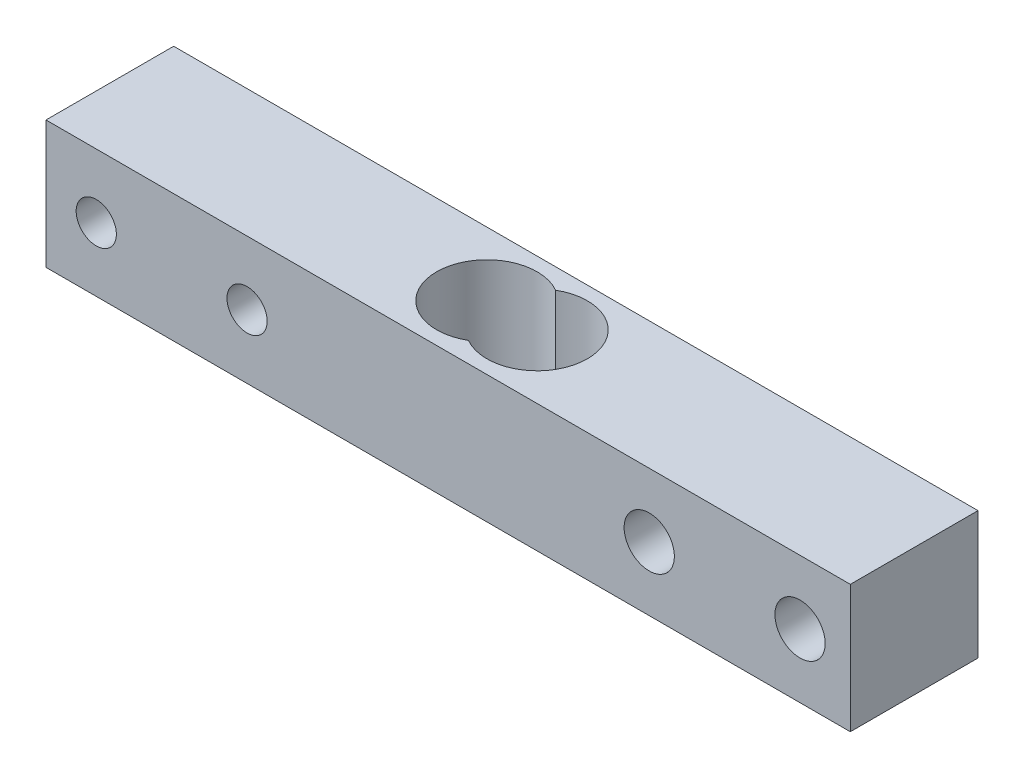
ISO-10303-21;
HEADER;
FILE_DESCRIPTION(('STEP AP214'),'2;1');
FILE_NAME('part.step','',(''),(''),'','','');
FILE_SCHEMA(('AUTOMOTIVE_DESIGN { 1 0 10303 214 1 1 1 1 }'));
ENDSEC;
DATA;
#1=APPLICATION_CONTEXT('core data for automotive mechanical design processes');
#2=APPLICATION_PROTOCOL_DEFINITION('international standard','automotive_design',2000,#1);
#3=PRODUCT_CONTEXT('',#1,'mechanical');
#4=PRODUCT('Part','Part','',(#3));
#5=PRODUCT_RELATED_PRODUCT_CATEGORY('part','',(#4));
#6=PRODUCT_DEFINITION_FORMATION('','',#4);
#7=PRODUCT_DEFINITION_CONTEXT('part definition',#1,'design');
#8=PRODUCT_DEFINITION('design','',#6,#7);
#9=PRODUCT_DEFINITION_SHAPE('','',#8);
#10=(LENGTH_UNIT() NAMED_UNIT(*) SI_UNIT(.MILLI.,.METRE.));
#11=(NAMED_UNIT(*) PLANE_ANGLE_UNIT() SI_UNIT($,.RADIAN.));
#12=(NAMED_UNIT(*) SI_UNIT($,.STERADIAN.) SOLID_ANGLE_UNIT());
#13=UNCERTAINTY_MEASURE_WITH_UNIT(LENGTH_MEASURE(1.E-05),#10,'distance_accuracy_value','');
#14=(GEOMETRIC_REPRESENTATION_CONTEXT(3) GLOBAL_UNCERTAINTY_ASSIGNED_CONTEXT((#13)) GLOBAL_UNIT_ASSIGNED_CONTEXT((#10,
#11,#12)) REPRESENTATION_CONTEXT('',''));
#15=CARTESIAN_POINT('',(0.,0.,0.));
#16=DIRECTION('',(0.,0.,1.));
#17=DIRECTION('',(1.,0.,0.));
#18=AXIS2_PLACEMENT_3D('',#15,#16,#17);
#19=CARTESIAN_POINT('',(40.,6.34999999999999,12.7));
#20=DIRECTION('',(-1.,0.,0.));
#21=DIRECTION('',(0.,0.,1.));
#22=AXIS2_PLACEMENT_3D('',#19,#20,#21);
#23=PLANE('',#22);
#24=DIRECTION('',(0.,1.,0.));
#25=VECTOR('',#24,1.);
#26=CARTESIAN_POINT('',(40.,6.35,0.));
#27=LINE('',#26,#25);
#28=CARTESIAN_POINT('',(40.,-6.35,0.));
#29=VERTEX_POINT('',#28);
#30=CARTESIAN_POINT('',(40.,6.35,0.));
#31=VERTEX_POINT('',#30);
#32=EDGE_CURVE('E120',#29,#31,#27,.T.);
#33=ORIENTED_EDGE('',*,*,#32,.T.);
#34=DIRECTION('',(0.,0.,-1.));
#35=VECTOR('',#34,1.);
#36=CARTESIAN_POINT('',(40.,6.34999999999999,12.7));
#37=LINE('',#36,#35);
#38=CARTESIAN_POINT('',(40.,6.34999999999999,12.7));
#39=VERTEX_POINT('',#38);
#40=EDGE_CURVE('E149',#39,#31,#37,.T.);
#41=ORIENTED_EDGE('',*,*,#40,.F.);
#42=DIRECTION('',(0.,1.,0.));
#43=VECTOR('',#42,1.);
#44=CARTESIAN_POINT('',(40.,6.34999999999999,12.7));
#45=LINE('',#44,#43);
#46=CARTESIAN_POINT('',(40.,-6.35000000000017,12.7));
#47=VERTEX_POINT('',#46);
#48=EDGE_CURVE('E123',#47,#39,#45,.T.);
#49=ORIENTED_EDGE('',*,*,#48,.F.);
#50=DIRECTION('',(0.,0.,-1.));
#51=VECTOR('',#50,1.);
#52=CARTESIAN_POINT('',(40.,-6.35000000000017,12.7));
#53=LINE('',#52,#51);
#54=EDGE_CURVE('E133',#47,#29,#53,.T.);
#55=ORIENTED_EDGE('',*,*,#54,.T.);
#56=EDGE_LOOP('',(#33,#41,#49,#55));
#57=FACE_BOUND('',#56,.T.);
#58=ADVANCED_FACE('F34',(#57),#23,.F.);
#59=CARTESIAN_POINT('',(-40.,6.35,12.7));
#60=DIRECTION('',(0.,-1.,0.));
#61=DIRECTION('',(0.,0.,-1.));
#62=AXIS2_PLACEMENT_3D('',#59,#60,#61);
#63=PLANE('',#62);
#64=CARTESIAN_POINT('',(-2.5,6.35,6.34999999999999));
#65=DIRECTION('',(0.,1.,0.));
#66=DIRECTION('',(0.,0.,1.));
#67=AXIS2_PLACEMENT_3D('',#64,#65,#66);
#68=CIRCLE('',#67,5.);
#69=CARTESIAN_POINT('',(0.,6.35,2.01987298107779));
#70=VERTEX_POINT('',#69);
#71=CARTESIAN_POINT('',(0.,6.35,10.6801270189222));
#72=VERTEX_POINT('',#71);
#73=EDGE_CURVE('E90',#70,#72,#68,.T.);
#74=ORIENTED_EDGE('',*,*,#73,.F.);
#75=CARTESIAN_POINT('',(2.5,6.35,6.34999999999984));
#76=DIRECTION('',(0.,1.,0.));
#77=DIRECTION('',(0.,0.,1.));
#78=AXIS2_PLACEMENT_3D('',#75,#76,#77);
#79=CIRCLE('',#78,4.99999999999999);
#80=EDGE_CURVE('E48',#72,#70,#79,.T.);
#81=ORIENTED_EDGE('',*,*,#80,.F.);
#82=EDGE_LOOP('',(#74,#81));
#83=FACE_BOUND('',#82,.T.);
#84=DIRECTION('',(-1.,0.,0.));
#85=VECTOR('',#84,1.);
#86=CARTESIAN_POINT('',(-40.,6.35,0.));
#87=LINE('',#86,#85);
#88=CARTESIAN_POINT('',(-40.,6.35,0.));
#89=VERTEX_POINT('',#88);
#90=EDGE_CURVE('E136',#31,#89,#87,.T.);
#91=ORIENTED_EDGE('',*,*,#90,.T.);
#92=DIRECTION('',(0.,0.,-1.));
#93=VECTOR('',#92,1.);
#94=CARTESIAN_POINT('',(-40.,6.35,12.7));
#95=LINE('',#94,#93);
#96=CARTESIAN_POINT('',(-40.,6.35,12.7));
#97=VERTEX_POINT('',#96);
#98=EDGE_CURVE('E146',#97,#89,#95,.T.);
#99=ORIENTED_EDGE('',*,*,#98,.F.);
#100=DIRECTION('',(-1.,0.,0.));
#101=VECTOR('',#100,1.);
#102=CARTESIAN_POINT('',(-40.,6.35,12.7));
#103=LINE('',#102,#101);
#104=EDGE_CURVE('E126',#39,#97,#103,.T.);
#105=ORIENTED_EDGE('',*,*,#104,.F.);
#106=ORIENTED_EDGE('',*,*,#40,.T.);
#107=EDGE_LOOP('',(#91,#99,#105,#106));
#108=FACE_BOUND('',#107,.T.);
#109=ADVANCED_FACE('F94',(#83,#108),#63,.F.);
#110=CARTESIAN_POINT('',(-40.,6.35,12.7));
#111=DIRECTION('',(1.,0.,0.));
#112=DIRECTION('',(0.,0.,-1.));
#113=AXIS2_PLACEMENT_3D('',#110,#111,#112);
#114=PLANE('',#113);
#115=DIRECTION('',(0.,-1.,0.));
#116=VECTOR('',#115,1.);
#117=CARTESIAN_POINT('',(-40.,6.35,0.));
#118=LINE('',#117,#116);
#119=CARTESIAN_POINT('',(-40.,-6.35,0.));
#120=VERTEX_POINT('',#119);
#121=EDGE_CURVE('E138',#89,#120,#118,.T.);
#122=ORIENTED_EDGE('',*,*,#121,.T.);
#123=DIRECTION('',(0.,0.,-1.));
#124=VECTOR('',#123,1.);
#125=CARTESIAN_POINT('',(-40.,-6.35,12.7));
#126=LINE('',#125,#124);
#127=CARTESIAN_POINT('',(-40.,-6.35,12.7));
#128=VERTEX_POINT('',#127);
#129=EDGE_CURVE('E143',#128,#120,#126,.T.);
#130=ORIENTED_EDGE('',*,*,#129,.F.);
#131=DIRECTION('',(0.,-1.,0.));
#132=VECTOR('',#131,1.);
#133=CARTESIAN_POINT('',(-40.,6.35,12.7));
#134=LINE('',#133,#132);
#135=EDGE_CURVE('E129',#97,#128,#134,.T.);
#136=ORIENTED_EDGE('',*,*,#135,.F.);
#137=ORIENTED_EDGE('',*,*,#98,.T.);
#138=EDGE_LOOP('',(#122,#130,#136,#137));
#139=FACE_BOUND('',#138,.T.);
#140=ADVANCED_FACE('F156',(#139),#114,.F.);
#141=CARTESIAN_POINT('',(-40.,-6.35,12.7));
#142=DIRECTION('',(0.,1.,0.));
#143=DIRECTION('',(0.,0.,1.));
#144=AXIS2_PLACEMENT_3D('',#141,#142,#143);
#145=PLANE('',#144);
#146=CARTESIAN_POINT('',(-2.5,-6.34999999999999,6.34999999999999));
#147=DIRECTION('',(0.,1.,0.));
#148=DIRECTION('',(0.,0.,1.));
#149=AXIS2_PLACEMENT_3D('',#146,#147,#148);
#150=CIRCLE('',#149,5.);
#151=CARTESIAN_POINT('',(0.,-6.35000000000002,2.01987298107764));
#152=VERTEX_POINT('',#151);
#153=CARTESIAN_POINT('',(0.,-6.35,10.680127018922));
#154=VERTEX_POINT('',#153);
#155=EDGE_CURVE('E41',#152,#154,#150,.T.);
#156=ORIENTED_EDGE('',*,*,#155,.T.);
#157=CARTESIAN_POINT('',(2.5,-6.35,6.34999999999983));
#158=DIRECTION('',(0.,1.,0.));
#159=DIRECTION('',(0.,0.,1.));
#160=AXIS2_PLACEMENT_3D('',#157,#158,#159);
#161=CIRCLE('',#160,4.99999999999999);
#162=EDGE_CURVE('E11',#154,#152,#161,.T.);
#163=ORIENTED_EDGE('',*,*,#162,.T.);
#164=EDGE_LOOP('',(#156,#163));
#165=FACE_BOUND('',#164,.T.);
#166=DIRECTION('',(1.,0.,0.));
#167=VECTOR('',#166,1.);
#168=CARTESIAN_POINT('',(-40.,-6.35,0.));
#169=LINE('',#168,#167);
#170=EDGE_CURVE('E127',#120,#29,#169,.T.);
#171=ORIENTED_EDGE('',*,*,#170,.T.);
#172=ORIENTED_EDGE('',*,*,#54,.F.);
#173=DIRECTION('',(1.,0.,0.));
#174=VECTOR('',#173,1.);
#175=CARTESIAN_POINT('',(-40.,-6.35,12.7));
#176=LINE('',#175,#174);
#177=EDGE_CURVE('E131',#128,#47,#176,.T.);
#178=ORIENTED_EDGE('',*,*,#177,.F.);
#179=ORIENTED_EDGE('',*,*,#129,.T.);
#180=EDGE_LOOP('',(#171,#172,#178,#179));
#181=FACE_BOUND('',#180,.T.);
#182=ADVANCED_FACE('F152',(#165,#181),#145,.F.);
#183=CARTESIAN_POINT('',(0.,0.,12.7));
#184=DIRECTION('',(0.,0.,1.));
#185=DIRECTION('',(1.,0.,0.));
#186=AXIS2_PLACEMENT_3D('',#183,#184,#185);
#187=PLANE('',#186);
#188=CARTESIAN_POINT('',(-20.,0.,12.7));
#189=DIRECTION('',(0.,0.,1.));
#190=DIRECTION('',(1.,0.,0.));
#191=AXIS2_PLACEMENT_3D('',#188,#189,#190);
#192=CIRCLE('',#191,2.);
#193=CARTESIAN_POINT('',(-18.,0.,12.7));
#194=VERTEX_POINT('',#193);
#195=EDGE_CURVE('E103',#194,#194,#192,.T.);
#196=ORIENTED_EDGE('',*,*,#195,.F.);
#197=EDGE_LOOP('',(#196));
#198=FACE_BOUND('',#197,.T.);
#199=CARTESIAN_POINT('',(20.,0.,12.7));
#200=DIRECTION('',(0.,0.,1.));
#201=DIRECTION('',(1.,0.,0.));
#202=AXIS2_PLACEMENT_3D('',#199,#200,#201);
#203=CIRCLE('',#202,2.5);
#204=CARTESIAN_POINT('',(22.5,0.,12.7));
#205=VERTEX_POINT('',#204);
#206=EDGE_CURVE('E109',#205,#205,#203,.T.);
#207=ORIENTED_EDGE('',*,*,#206,.F.);
#208=EDGE_LOOP('',(#207));
#209=FACE_BOUND('',#208,.T.);
#210=CARTESIAN_POINT('',(35.,0.,12.7));
#211=DIRECTION('',(0.,0.,1.));
#212=DIRECTION('',(1.,0.,0.));
#213=AXIS2_PLACEMENT_3D('',#210,#211,#212);
#214=CIRCLE('',#213,2.5);
#215=CARTESIAN_POINT('',(37.5,0.,12.7));
#216=VERTEX_POINT('',#215);
#217=EDGE_CURVE('E86',#216,#216,#214,.T.);
#218=ORIENTED_EDGE('',*,*,#217,.F.);
#219=EDGE_LOOP('',(#218));
#220=FACE_BOUND('',#219,.T.);
#221=CARTESIAN_POINT('',(-35.,0.,12.7));
#222=DIRECTION('',(0.,0.,1.));
#223=DIRECTION('',(1.,0.,0.));
#224=AXIS2_PLACEMENT_3D('',#221,#222,#223);
#225=CIRCLE('',#224,2.);
#226=CARTESIAN_POINT('',(-33.,0.,12.7));
#227=VERTEX_POINT('',#226);
#228=EDGE_CURVE('E102',#227,#227,#225,.T.);
#229=ORIENTED_EDGE('',*,*,#228,.F.);
#230=EDGE_LOOP('',(#229));
#231=FACE_BOUND('',#230,.T.);
#232=ORIENTED_EDGE('',*,*,#48,.T.);
#233=ORIENTED_EDGE('',*,*,#104,.T.);
#234=ORIENTED_EDGE('',*,*,#135,.T.);
#235=ORIENTED_EDGE('',*,*,#177,.T.);
#236=EDGE_LOOP('',(#232,#233,#234,#235));
#237=FACE_BOUND('',#236,.T.);
#238=ADVANCED_FACE('F155',(#198,#209,#220,#231,#237),#187,.T.);
#239=CARTESIAN_POINT('',(0.,0.,0.));
#240=DIRECTION('',(0.,0.,1.));
#241=DIRECTION('',(1.,0.,0.));
#242=AXIS2_PLACEMENT_3D('',#239,#240,#241);
#243=PLANE('',#242);
#244=CARTESIAN_POINT('',(-20.,0.,0.));
#245=DIRECTION('',(0.,0.,1.));
#246=DIRECTION('',(1.,0.,0.));
#247=AXIS2_PLACEMENT_3D('',#244,#245,#246);
#248=CIRCLE('',#247,2.);
#249=CARTESIAN_POINT('',(-18.,0.,0.));
#250=VERTEX_POINT('',#249);
#251=EDGE_CURVE('E99',#250,#250,#248,.T.);
#252=ORIENTED_EDGE('',*,*,#251,.T.);
#253=EDGE_LOOP('',(#252));
#254=FACE_BOUND('',#253,.T.);
#255=CARTESIAN_POINT('',(20.,0.,0.));
#256=DIRECTION('',(0.,0.,1.));
#257=DIRECTION('',(1.,0.,0.));
#258=AXIS2_PLACEMENT_3D('',#255,#256,#257);
#259=CIRCLE('',#258,2.5);
#260=CARTESIAN_POINT('',(22.5,0.,0.));
#261=VERTEX_POINT('',#260);
#262=EDGE_CURVE('E106',#261,#261,#259,.T.);
#263=ORIENTED_EDGE('',*,*,#262,.T.);
#264=EDGE_LOOP('',(#263));
#265=FACE_BOUND('',#264,.T.);
#266=CARTESIAN_POINT('',(35.,0.,0.));
#267=DIRECTION('',(0.,0.,1.));
#268=DIRECTION('',(1.,0.,0.));
#269=AXIS2_PLACEMENT_3D('',#266,#267,#268);
#270=CIRCLE('',#269,2.5);
#271=CARTESIAN_POINT('',(37.5,0.,0.));
#272=VERTEX_POINT('',#271);
#273=EDGE_CURVE('E112',#272,#272,#270,.T.);
#274=ORIENTED_EDGE('',*,*,#273,.T.);
#275=EDGE_LOOP('',(#274));
#276=FACE_BOUND('',#275,.T.);
#277=CARTESIAN_POINT('',(-35.,0.,0.));
#278=DIRECTION('',(0.,0.,1.));
#279=DIRECTION('',(1.,0.,0.));
#280=AXIS2_PLACEMENT_3D('',#277,#278,#279);
#281=CIRCLE('',#280,2.);
#282=CARTESIAN_POINT('',(-33.,0.,0.));
#283=VERTEX_POINT('',#282);
#284=EDGE_CURVE('E117',#283,#283,#281,.T.);
#285=ORIENTED_EDGE('',*,*,#284,.T.);
#286=EDGE_LOOP('',(#285));
#287=FACE_BOUND('',#286,.T.);
#288=ORIENTED_EDGE('',*,*,#32,.F.);
#289=ORIENTED_EDGE('',*,*,#170,.F.);
#290=ORIENTED_EDGE('',*,*,#121,.F.);
#291=ORIENTED_EDGE('',*,*,#90,.F.);
#292=EDGE_LOOP('',(#288,#289,#290,#291));
#293=FACE_BOUND('',#292,.T.);
#294=ADVANCED_FACE('F168',(#254,#265,#276,#287,#293),#243,.F.);
#295=CARTESIAN_POINT('',(-35.,0.,0.));
#296=DIRECTION('',(0.,0.,1.));
#297=DIRECTION('',(1.,0.,0.));
#298=AXIS2_PLACEMENT_3D('',#295,#296,#297);
#299=CYLINDRICAL_SURFACE('',#298,2.);
#300=ORIENTED_EDGE('',*,*,#284,.F.);
#301=EDGE_LOOP('',(#300));
#302=FACE_BOUND('',#301,.T.);
#303=ORIENTED_EDGE('',*,*,#228,.T.);
#304=EDGE_LOOP('',(#303));
#305=FACE_BOUND('',#304,.T.);
#306=ADVANCED_FACE('F213',(#302,#305),#299,.F.);
#307=CARTESIAN_POINT('',(35.,0.,0.));
#308=DIRECTION('',(0.,0.,1.));
#309=DIRECTION('',(1.,0.,0.));
#310=AXIS2_PLACEMENT_3D('',#307,#308,#309);
#311=CYLINDRICAL_SURFACE('',#310,2.5);
#312=ORIENTED_EDGE('',*,*,#273,.F.);
#313=EDGE_LOOP('',(#312));
#314=FACE_BOUND('',#313,.T.);
#315=ORIENTED_EDGE('',*,*,#217,.T.);
#316=EDGE_LOOP('',(#315));
#317=FACE_BOUND('',#316,.T.);
#318=ADVANCED_FACE('F223',(#314,#317),#311,.F.);
#319=CARTESIAN_POINT('',(20.,0.,0.));
#320=DIRECTION('',(0.,0.,1.));
#321=DIRECTION('',(1.,0.,0.));
#322=AXIS2_PLACEMENT_3D('',#319,#320,#321);
#323=CYLINDRICAL_SURFACE('',#322,2.5);
#324=ORIENTED_EDGE('',*,*,#262,.F.);
#325=EDGE_LOOP('',(#324));
#326=FACE_BOUND('',#325,.T.);
#327=ORIENTED_EDGE('',*,*,#206,.T.);
#328=EDGE_LOOP('',(#327));
#329=FACE_BOUND('',#328,.T.);
#330=ADVANCED_FACE('F233',(#326,#329),#323,.F.);
#331=CARTESIAN_POINT('',(-20.,0.,0.));
#332=DIRECTION('',(0.,0.,1.));
#333=DIRECTION('',(1.,0.,0.));
#334=AXIS2_PLACEMENT_3D('',#331,#332,#333);
#335=CYLINDRICAL_SURFACE('',#334,2.);
#336=ORIENTED_EDGE('',*,*,#251,.F.);
#337=EDGE_LOOP('',(#336));
#338=FACE_BOUND('',#337,.T.);
#339=ORIENTED_EDGE('',*,*,#195,.T.);
#340=EDGE_LOOP('',(#339));
#341=FACE_BOUND('',#340,.T.);
#342=ADVANCED_FACE('F243',(#338,#341),#335,.F.);
#343=CARTESIAN_POINT('',(2.5,-13.35,6.34999999999998));
#344=DIRECTION('',(0.,1.,0.));
#345=DIRECTION('',(0.,0.,1.));
#346=AXIS2_PLACEMENT_3D('',#343,#344,#345);
#347=CYLINDRICAL_SURFACE('',#346,4.99999999999999);
#348=DIRECTION('',(0.,1.,0.));
#349=VECTOR('',#348,1.);
#350=CARTESIAN_POINT('',(0.,-13.35,10.6801270189222));
#351=LINE('',#350,#349);
#352=EDGE_CURVE('E55',#154,#72,#351,.T.);
#353=ORIENTED_EDGE('',*,*,#352,.T.);
#354=ORIENTED_EDGE('',*,*,#80,.T.);
#355=DIRECTION('',(0.,1.,0.));
#356=VECTOR('',#355,1.);
#357=CARTESIAN_POINT('',(0.,-13.35,2.01987298107779));
#358=LINE('',#357,#356);
#359=EDGE_CURVE('E87',#152,#70,#358,.T.);
#360=ORIENTED_EDGE('',*,*,#359,.F.);
#361=ORIENTED_EDGE('',*,*,#162,.F.);
#362=EDGE_LOOP('',(#353,#354,#360,#361));
#363=FACE_BOUND('',#362,.T.);
#364=ADVANCED_FACE('F84',(#363),#347,.F.);
#365=CARTESIAN_POINT('',(-2.5,-13.35,6.34999999999999));
#366=DIRECTION('',(0.,1.,0.));
#367=DIRECTION('',(0.,0.,1.));
#368=AXIS2_PLACEMENT_3D('',#365,#366,#367);
#369=CYLINDRICAL_SURFACE('',#368,5.);
#370=ORIENTED_EDGE('',*,*,#359,.T.);
#371=ORIENTED_EDGE('',*,*,#73,.T.);
#372=ORIENTED_EDGE('',*,*,#352,.F.);
#373=ORIENTED_EDGE('',*,*,#155,.F.);
#374=EDGE_LOOP('',(#370,#371,#372,#373));
#375=FACE_BOUND('',#374,.T.);
#376=ADVANCED_FACE('F91',(#375),#369,.F.);
#377=CLOSED_SHELL('',(#58,#109,#140,#182,#238,#294,#306,#318,#330,#342,#364,#376));
#378=MANIFOLD_SOLID_BREP('B2',#377);
#379=ADVANCED_BREP_SHAPE_REPRESENTATION('',(#18,#378),#14);
#380=SHAPE_DEFINITION_REPRESENTATION(#9,#379);
ENDSEC;
END-ISO-10303-21;
